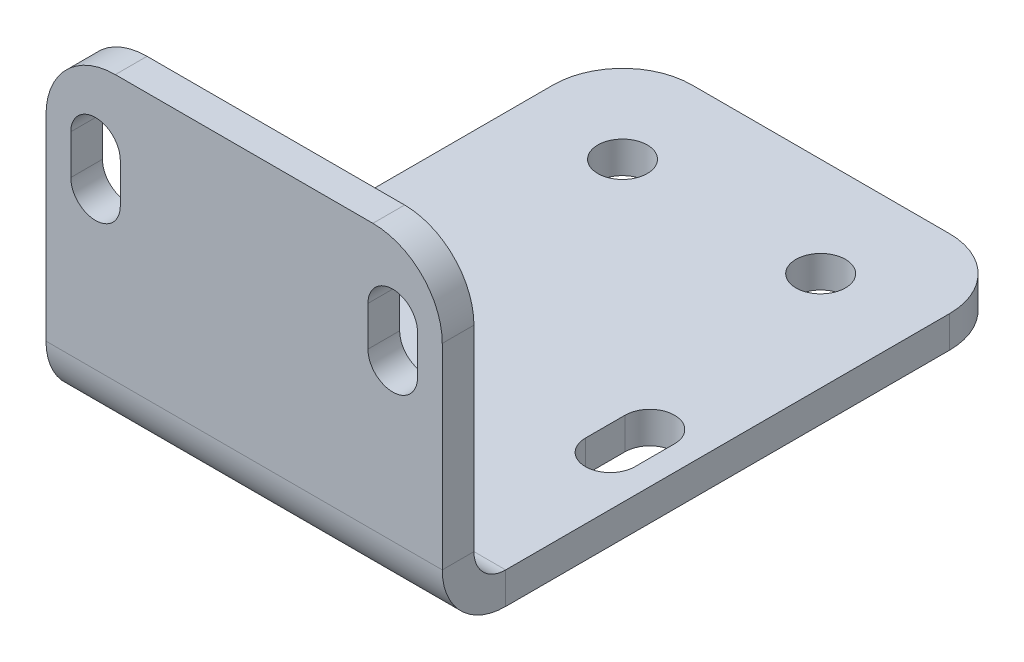
ISO-10303-21;
HEADER;
FILE_DESCRIPTION(('STEP AP214'),'2;1');
FILE_NAME('part.step','',(''),(''),'','','');
FILE_SCHEMA(('AUTOMOTIVE_DESIGN { 1 0 10303 214 1 1 1 1 }'));
ENDSEC;
DATA;
#1=APPLICATION_CONTEXT('core data for automotive mechanical design processes');
#2=APPLICATION_PROTOCOL_DEFINITION('international standard','automotive_design',2000,#1);
#3=PRODUCT_CONTEXT('',#1,'mechanical');
#4=PRODUCT('Part','Part','',(#3));
#5=PRODUCT_RELATED_PRODUCT_CATEGORY('part','',(#4));
#6=PRODUCT_DEFINITION_FORMATION('','',#4);
#7=PRODUCT_DEFINITION_CONTEXT('part definition',#1,'design');
#8=PRODUCT_DEFINITION('design','',#6,#7);
#9=PRODUCT_DEFINITION_SHAPE('','',#8);
#10=(LENGTH_UNIT() NAMED_UNIT(*) SI_UNIT(.MILLI.,.METRE.));
#11=(NAMED_UNIT(*) PLANE_ANGLE_UNIT() SI_UNIT($,.RADIAN.));
#12=(NAMED_UNIT(*) SI_UNIT($,.STERADIAN.) SOLID_ANGLE_UNIT());
#13=UNCERTAINTY_MEASURE_WITH_UNIT(LENGTH_MEASURE(1.E-05),#10,'distance_accuracy_value','');
#14=(GEOMETRIC_REPRESENTATION_CONTEXT(3) GLOBAL_UNCERTAINTY_ASSIGNED_CONTEXT((#13)) GLOBAL_UNIT_ASSIGNED_CONTEXT((#10,
#11,#12)) REPRESENTATION_CONTEXT('',''));
#15=CARTESIAN_POINT('',(0.,0.,0.));
#16=DIRECTION('',(0.,0.,1.));
#17=DIRECTION('',(1.,0.,0.));
#18=AXIS2_PLACEMENT_3D('',#15,#16,#17);
#19=CARTESIAN_POINT('',(66.59293258347,-30.0000000000001,-22.75));
#20=DIRECTION('',(0.,1.,0.));
#21=DIRECTION('',(0.,0.,1.));
#22=AXIS2_PLACEMENT_3D('',#19,#20,#21);
#23=CYLINDRICAL_SURFACE('',#22,2.5);
#24=DIRECTION('',(0.,1.,0.));
#25=VECTOR('',#24,1.);
#26=CARTESIAN_POINT('',(64.09293258347,-30.0000000000001,-22.75));
#27=LINE('',#26,#25);
#28=CARTESIAN_POINT('',(64.09293258347,-33.2000000000001,-22.75));
#29=VERTEX_POINT('',#28);
#30=CARTESIAN_POINT('',(64.09293258347,-30.0000000000001,-22.75));
#31=VERTEX_POINT('',#30);
#32=EDGE_CURVE('E11',#29,#31,#27,.T.);
#33=ORIENTED_EDGE('',*,*,#32,.F.);
#34=CARTESIAN_POINT('',(66.59293258347,-33.2000000000001,-22.75));
#35=DIRECTION('',(0.,1.,0.));
#36=DIRECTION('',(0.,0.,1.));
#37=AXIS2_PLACEMENT_3D('',#34,#35,#36);
#38=CIRCLE('',#37,2.5);
#39=CARTESIAN_POINT('',(69.09293258347,-33.2000000000001,-22.75));
#40=VERTEX_POINT('',#39);
#41=EDGE_CURVE('E167',#40,#29,#38,.T.);
#42=ORIENTED_EDGE('',*,*,#41,.F.);
#43=DIRECTION('',(0.,1.,0.));
#44=VECTOR('',#43,1.);
#45=CARTESIAN_POINT('',(69.09293258347,-30.0000000000001,-22.75));
#46=LINE('',#45,#44);
#47=CARTESIAN_POINT('',(69.09293258347,-30.0000000000001,-22.75));
#48=VERTEX_POINT('',#47);
#49=EDGE_CURVE('E47',#40,#48,#46,.T.);
#50=ORIENTED_EDGE('',*,*,#49,.T.);
#51=CARTESIAN_POINT('',(66.59293258347,-30.0000000000001,-22.75));
#52=DIRECTION('',(0.,1.,0.));
#53=DIRECTION('',(1.,0.,0.));
#54=AXIS2_PLACEMENT_3D('',#51,#52,#53);
#55=CIRCLE('',#54,2.5);
#56=EDGE_CURVE('E258',#48,#31,#55,.T.);
#57=ORIENTED_EDGE('',*,*,#56,.T.);
#58=EDGE_LOOP('',(#33,#42,#50,#57));
#59=FACE_BOUND('',#58,.T.);
#60=ADVANCED_FACE('F37',(#59),#23,.F.);
#61=CARTESIAN_POINT('',(69.09293258347,-30.0000000000001,-18.75));
#62=DIRECTION('',(-1.,0.,0.));
#63=DIRECTION('',(0.,0.,-1.));
#64=AXIS2_PLACEMENT_3D('',#61,#62,#63);
#65=PLANE('',#64);
#66=ORIENTED_EDGE('',*,*,#49,.F.);
#67=DIRECTION('',(0.,0.,1.));
#68=VECTOR('',#67,1.);
#69=CARTESIAN_POINT('',(69.09293258347,-33.2000000000001,-30.));
#70=LINE('',#69,#68);
#71=CARTESIAN_POINT('',(69.09293258347,-33.2000000000001,-18.75));
#72=VERTEX_POINT('',#71);
#73=EDGE_CURVE('E180',#72,#40,#70,.F.);
#74=ORIENTED_EDGE('',*,*,#73,.F.);
#75=DIRECTION('',(0.,1.,0.));
#76=VECTOR('',#75,1.);
#77=CARTESIAN_POINT('',(69.09293258347,-30.0000000000001,-18.75));
#78=LINE('',#77,#76);
#79=CARTESIAN_POINT('',(69.09293258347,-30.0000000000001,-18.75));
#80=VERTEX_POINT('',#79);
#81=EDGE_CURVE('E159',#72,#80,#78,.T.);
#82=ORIENTED_EDGE('',*,*,#81,.T.);
#83=DIRECTION('',(0.,0.,-1.));
#84=VECTOR('',#83,1.);
#85=CARTESIAN_POINT('',(69.09293258347,-30.0000000000001,-18.75));
#86=LINE('',#85,#84);
#87=EDGE_CURVE('E266',#80,#48,#86,.T.);
#88=ORIENTED_EDGE('',*,*,#87,.T.);
#89=EDGE_LOOP('',(#66,#74,#82,#88));
#90=FACE_BOUND('',#89,.T.);
#91=ADVANCED_FACE('F268',(#90),#65,.T.);
#92=CARTESIAN_POINT('',(66.59293258347,-30.0000000000001,-18.75));
#93=DIRECTION('',(0.,1.,0.));
#94=DIRECTION('',(0.,0.,1.));
#95=AXIS2_PLACEMENT_3D('',#92,#93,#94);
#96=CYLINDRICAL_SURFACE('',#95,2.5);
#97=ORIENTED_EDGE('',*,*,#81,.F.);
#98=CARTESIAN_POINT('',(66.59293258347,-33.2000000000001,-18.75));
#99=DIRECTION('',(0.,1.,0.));
#100=DIRECTION('',(0.,0.,1.));
#101=AXIS2_PLACEMENT_3D('',#98,#99,#100);
#102=CIRCLE('',#101,2.5);
#103=CARTESIAN_POINT('',(64.09293258347,-33.2000000000001,-18.75));
#104=VERTEX_POINT('',#103);
#105=EDGE_CURVE('E165',#104,#72,#102,.T.);
#106=ORIENTED_EDGE('',*,*,#105,.F.);
#107=DIRECTION('',(0.,1.,0.));
#108=VECTOR('',#107,1.);
#109=CARTESIAN_POINT('',(64.09293258347,-30.0000000000001,-18.75));
#110=LINE('',#109,#108);
#111=CARTESIAN_POINT('',(64.09293258347,-30.0000000000001,-18.75));
#112=VERTEX_POINT('',#111);
#113=EDGE_CURVE('E41',#104,#112,#110,.T.);
#114=ORIENTED_EDGE('',*,*,#113,.T.);
#115=CARTESIAN_POINT('',(66.59293258347,-30.0000000000001,-18.75));
#116=DIRECTION('',(0.,1.,0.));
#117=DIRECTION('',(1.,0.,0.));
#118=AXIS2_PLACEMENT_3D('',#115,#116,#117);
#119=CIRCLE('',#118,2.5);
#120=EDGE_CURVE('E522',#112,#80,#119,.T.);
#121=ORIENTED_EDGE('',*,*,#120,.T.);
#122=EDGE_LOOP('',(#97,#106,#114,#121));
#123=FACE_BOUND('',#122,.T.);
#124=ADVANCED_FACE('F169',(#123),#96,.F.);
#125=CARTESIAN_POINT('',(36.5929325836299,-30.0000000000001,-22.75));
#126=DIRECTION('',(0.,1.,0.));
#127=DIRECTION('',(0.,0.,1.));
#128=AXIS2_PLACEMENT_3D('',#125,#126,#127);
#129=CYLINDRICAL_SURFACE('',#128,2.5);
#130=DIRECTION('',(0.,1.,0.));
#131=VECTOR('',#130,1.);
#132=CARTESIAN_POINT('',(34.0929325836299,-30.0000000000001,-22.75));
#133=LINE('',#132,#131);
#134=CARTESIAN_POINT('',(34.0929325836299,-33.2000000000001,-22.75));
#135=VERTEX_POINT('',#134);
#136=CARTESIAN_POINT('',(34.0929325836299,-30.0000000000001,-22.75));
#137=VERTEX_POINT('',#136);
#138=EDGE_CURVE('E160',#135,#137,#133,.T.);
#139=ORIENTED_EDGE('',*,*,#138,.F.);
#140=CARTESIAN_POINT('',(36.5929325836299,-33.2000000000001,-22.75));
#141=DIRECTION('',(0.,1.,0.));
#142=DIRECTION('',(0.,0.,1.));
#143=AXIS2_PLACEMENT_3D('',#140,#141,#142);
#144=CIRCLE('',#143,2.5);
#145=CARTESIAN_POINT('',(39.0929325836299,-33.2000000000001,-22.75));
#146=VERTEX_POINT('',#145);
#147=EDGE_CURVE('E400',#146,#135,#144,.T.);
#148=ORIENTED_EDGE('',*,*,#147,.F.);
#149=DIRECTION('',(0.,1.,0.));
#150=VECTOR('',#149,1.);
#151=CARTESIAN_POINT('',(39.0929325836299,-30.0000000000001,-22.75));
#152=LINE('',#151,#150);
#153=CARTESIAN_POINT('',(39.0929325836299,-30.0000000000001,-22.75));
#154=VERTEX_POINT('',#153);
#155=EDGE_CURVE('E246',#146,#154,#152,.T.);
#156=ORIENTED_EDGE('',*,*,#155,.T.);
#157=CARTESIAN_POINT('',(36.5929325836299,-30.0000000000001,-22.75));
#158=DIRECTION('',(0.,1.,0.));
#159=DIRECTION('',(1.,0.,0.));
#160=AXIS2_PLACEMENT_3D('',#157,#158,#159);
#161=CIRCLE('',#160,2.5);
#162=EDGE_CURVE('E533',#154,#137,#161,.T.);
#163=ORIENTED_EDGE('',*,*,#162,.T.);
#164=EDGE_LOOP('',(#139,#148,#156,#163));
#165=FACE_BOUND('',#164,.T.);
#166=ADVANCED_FACE('F578',(#165),#129,.F.);
#167=CARTESIAN_POINT('',(39.0929325836299,-30.0000000000001,-18.75));
#168=DIRECTION('',(-1.,0.,0.));
#169=DIRECTION('',(0.,0.,-1.));
#170=AXIS2_PLACEMENT_3D('',#167,#168,#169);
#171=PLANE('',#170);
#172=ORIENTED_EDGE('',*,*,#155,.F.);
#173=DIRECTION('',(0.,0.,1.));
#174=VECTOR('',#173,1.);
#175=CARTESIAN_POINT('',(39.0929325836299,-33.2000000000001,-30.));
#176=LINE('',#175,#174);
#177=CARTESIAN_POINT('',(39.0929325836299,-33.2000000000001,-18.75));
#178=VERTEX_POINT('',#177);
#179=EDGE_CURVE('E385',#178,#146,#176,.F.);
#180=ORIENTED_EDGE('',*,*,#179,.F.);
#181=DIRECTION('',(0.,1.,0.));
#182=VECTOR('',#181,1.);
#183=CARTESIAN_POINT('',(39.0929325836299,-30.0000000000001,-18.75));
#184=LINE('',#183,#182);
#185=CARTESIAN_POINT('',(39.0929325836299,-30.0000000000001,-18.75));
#186=VERTEX_POINT('',#185);
#187=EDGE_CURVE('E243',#178,#186,#184,.T.);
#188=ORIENTED_EDGE('',*,*,#187,.T.);
#189=DIRECTION('',(0.,0.,-1.));
#190=VECTOR('',#189,1.);
#191=CARTESIAN_POINT('',(39.0929325836299,-30.0000000000001,-18.75));
#192=LINE('',#191,#190);
#193=EDGE_CURVE('E421',#186,#154,#192,.T.);
#194=ORIENTED_EDGE('',*,*,#193,.T.);
#195=EDGE_LOOP('',(#172,#180,#188,#194));
#196=FACE_BOUND('',#195,.T.);
#197=ADVANCED_FACE('F419',(#196),#171,.T.);
#198=CARTESIAN_POINT('',(36.5929325836299,-30.0000000000001,-18.75));
#199=DIRECTION('',(0.,1.,0.));
#200=DIRECTION('',(0.,0.,1.));
#201=AXIS2_PLACEMENT_3D('',#198,#199,#200);
#202=CYLINDRICAL_SURFACE('',#201,2.5);
#203=ORIENTED_EDGE('',*,*,#187,.F.);
#204=CARTESIAN_POINT('',(36.5929325836299,-33.2000000000001,-18.75));
#205=DIRECTION('',(0.,1.,0.));
#206=DIRECTION('',(0.,0.,1.));
#207=AXIS2_PLACEMENT_3D('',#204,#205,#206);
#208=CIRCLE('',#207,2.5);
#209=CARTESIAN_POINT('',(34.0929325836299,-33.2000000000001,-18.75));
#210=VERTEX_POINT('',#209);
#211=EDGE_CURVE('E396',#210,#178,#208,.T.);
#212=ORIENTED_EDGE('',*,*,#211,.F.);
#213=DIRECTION('',(0.,1.,0.));
#214=VECTOR('',#213,1.);
#215=CARTESIAN_POINT('',(34.0929325836299,-30.0000000000001,-18.75));
#216=LINE('',#215,#214);
#217=CARTESIAN_POINT('',(34.0929325836299,-30.0000000000001,-18.75));
#218=VERTEX_POINT('',#217);
#219=EDGE_CURVE('E241',#210,#218,#216,.T.);
#220=ORIENTED_EDGE('',*,*,#219,.T.);
#221=CARTESIAN_POINT('',(36.5929325836299,-30.0000000000001,-18.75));
#222=DIRECTION('',(0.,1.,0.));
#223=DIRECTION('',(1.,0.,0.));
#224=AXIS2_PLACEMENT_3D('',#221,#222,#223);
#225=CIRCLE('',#224,2.5);
#226=EDGE_CURVE('E415',#218,#186,#225,.T.);
#227=ORIENTED_EDGE('',*,*,#226,.T.);
#228=EDGE_LOOP('',(#203,#212,#220,#227));
#229=FACE_BOUND('',#228,.T.);
#230=ADVANCED_FACE('F411',(#229),#202,.F.);
#231=CARTESIAN_POINT('',(71.5929325834699,-30.0000000000001,-30.));
#232=DIRECTION('',(-1.,0.,0.));
#233=DIRECTION('',(0.,0.,-1.));
#234=AXIS2_PLACEMENT_3D('',#231,#232,#233);
#235=PLANE('',#234);
#236=DIRECTION('',(0.,1.,0.));
#237=VECTOR('',#236,1.);
#238=CARTESIAN_POINT('',(71.59293258347,-30.,-3.19999999999999));
#239=LINE('',#238,#237);
#240=CARTESIAN_POINT('',(71.59293258347,-33.2,-3.19999999999998));
#241=VERTEX_POINT('',#240);
#242=CARTESIAN_POINT('',(71.59293258347,-30.,-3.19999999999999));
#243=VERTEX_POINT('',#242);
#244=EDGE_CURVE('E238',#241,#243,#239,.T.);
#245=ORIENTED_EDGE('',*,*,#244,.F.);
#246=DIRECTION('',(0.,0.,1.));
#247=VECTOR('',#246,1.);
#248=CARTESIAN_POINT('',(71.59293258347,-33.2000000000001,-30.));
#249=LINE('',#248,#247);
#250=CARTESIAN_POINT('',(71.5929325834699,-33.2000000000002,-48.));
#251=VERTEX_POINT('',#250);
#252=EDGE_CURVE('E174',#241,#251,#249,.F.);
#253=ORIENTED_EDGE('',*,*,#252,.T.);
#254=DIRECTION('',(0.,1.,0.));
#255=VECTOR('',#254,1.);
#256=CARTESIAN_POINT('',(71.5929325834699,-30.0000000000002,-48.));
#257=LINE('',#256,#255);
#258=CARTESIAN_POINT('',(71.5929325834699,-30.0000000000002,-48.));
#259=VERTEX_POINT('',#258);
#260=EDGE_CURVE('E235',#251,#259,#257,.T.);
#261=ORIENTED_EDGE('',*,*,#260,.T.);
#262=DIRECTION('',(0.,0.,-1.));
#263=VECTOR('',#262,1.);
#264=CARTESIAN_POINT('',(71.5929325834699,-30.0000000000001,-30.));
#265=LINE('',#264,#263);
#266=EDGE_CURVE('E313',#243,#259,#265,.T.);
#267=ORIENTED_EDGE('',*,*,#266,.F.);
#268=EDGE_LOOP('',(#245,#253,#261,#267));
#269=FACE_BOUND('',#268,.T.);
#270=ADVANCED_FACE('F475',(#269),#235,.F.);
#271=CARTESIAN_POINT('',(64.59293258347,-30.0000000000002,-48.));
#272=DIRECTION('',(0.,-1.,0.));
#273=DIRECTION('',(0.,0.,-1.));
#274=AXIS2_PLACEMENT_3D('',#271,#272,#273);
#275=CYLINDRICAL_SURFACE('',#274,7.);
#276=ORIENTED_EDGE('',*,*,#260,.F.);
#277=CARTESIAN_POINT('',(64.59293258347,-33.2000000000002,-48.));
#278=DIRECTION('',(0.,-1.,0.));
#279=DIRECTION('',(0.,0.,-1.));
#280=AXIS2_PLACEMENT_3D('',#277,#278,#279);
#281=CIRCLE('',#280,7.);
#282=CARTESIAN_POINT('',(64.59293258347,-33.2000000000002,-55.));
#283=VERTEX_POINT('',#282);
#284=EDGE_CURVE('E171',#251,#283,#281,.F.);
#285=ORIENTED_EDGE('',*,*,#284,.T.);
#286=DIRECTION('',(0.,1.,0.));
#287=VECTOR('',#286,1.);
#288=CARTESIAN_POINT('',(64.59293258347,-30.0000000000001,-55.));
#289=LINE('',#288,#287);
#290=CARTESIAN_POINT('',(64.59293258347,-30.0000000000001,-55.));
#291=VERTEX_POINT('',#290);
#292=EDGE_CURVE('E232',#283,#291,#289,.T.);
#293=ORIENTED_EDGE('',*,*,#292,.T.);
#294=CARTESIAN_POINT('',(64.59293258347,-30.0000000000002,-48.));
#295=DIRECTION('',(0.,-1.,0.));
#296=DIRECTION('',(0.,0.,-1.));
#297=AXIS2_PLACEMENT_3D('',#294,#295,#296);
#298=CIRCLE('',#297,7.);
#299=EDGE_CURVE('E479',#259,#291,#298,.F.);
#300=ORIENTED_EDGE('',*,*,#299,.F.);
#301=EDGE_LOOP('',(#276,#285,#293,#300));
#302=FACE_BOUND('',#301,.T.);
#303=ADVANCED_FACE('F520',(#302),#275,.T.);
#304=CARTESIAN_POINT('',(31.5929325836299,-30.0000000000001,-55.));
#305=DIRECTION('',(0.,0.,-1.));
#306=DIRECTION('',(1.,0.,0.));
#307=AXIS2_PLACEMENT_3D('',#304,#305,#306);
#308=PLANE('',#307);
#309=ORIENTED_EDGE('',*,*,#292,.F.);
#310=DIRECTION('',(1.,0.,0.));
#311=VECTOR('',#310,1.);
#312=CARTESIAN_POINT('',(0.,-33.2000000000002,-55.));
#313=LINE('',#312,#311);
#314=CARTESIAN_POINT('',(38.5929325836299,-33.2000000000002,-55.));
#315=VERTEX_POINT('',#314);
#316=EDGE_CURVE('E383',#315,#283,#313,.T.);
#317=ORIENTED_EDGE('',*,*,#316,.F.);
#318=DIRECTION('',(0.,1.,0.));
#319=VECTOR('',#318,1.);
#320=CARTESIAN_POINT('',(38.5929325836299,-30.0000000000001,-55.));
#321=LINE('',#320,#319);
#322=CARTESIAN_POINT('',(38.5929325836299,-30.0000000000001,-55.));
#323=VERTEX_POINT('',#322);
#324=EDGE_CURVE('E229',#315,#323,#321,.T.);
#325=ORIENTED_EDGE('',*,*,#324,.T.);
#326=DIRECTION('',(1.,0.,0.));
#327=VECTOR('',#326,1.);
#328=CARTESIAN_POINT('',(31.5929325836299,-30.0000000000001,-55.));
#329=LINE('',#328,#327);
#330=EDGE_CURVE('E530',#323,#291,#329,.T.);
#331=ORIENTED_EDGE('',*,*,#330,.T.);
#332=EDGE_LOOP('',(#309,#317,#325,#331));
#333=FACE_BOUND('',#332,.T.);
#334=ADVANCED_FACE('F592',(#333),#308,.T.);
#335=CARTESIAN_POINT('',(38.5929325836299,-30.0000000000002,-48.));
#336=DIRECTION('',(0.,-1.,0.));
#337=DIRECTION('',(0.,0.,-1.));
#338=AXIS2_PLACEMENT_3D('',#335,#336,#337);
#339=CYLINDRICAL_SURFACE('',#338,7.);
#340=ORIENTED_EDGE('',*,*,#324,.F.);
#341=CARTESIAN_POINT('',(38.5929325836299,-33.2000000000002,-48.));
#342=DIRECTION('',(0.,-1.,0.));
#343=DIRECTION('',(0.,0.,-1.));
#344=AXIS2_PLACEMENT_3D('',#341,#342,#343);
#345=CIRCLE('',#344,7.);
#346=CARTESIAN_POINT('',(31.5929325836299,-33.2000000000002,-48.));
#347=VERTEX_POINT('',#346);
#348=EDGE_CURVE('E380',#315,#347,#345,.F.);
#349=ORIENTED_EDGE('',*,*,#348,.T.);
#350=DIRECTION('',(0.,1.,0.));
#351=VECTOR('',#350,1.);
#352=CARTESIAN_POINT('',(31.5929325836299,-30.0000000000002,-48.));
#353=LINE('',#352,#351);
#354=CARTESIAN_POINT('',(31.5929325836299,-30.0000000000002,-48.));
#355=VERTEX_POINT('',#354);
#356=EDGE_CURVE('E226',#347,#355,#353,.T.);
#357=ORIENTED_EDGE('',*,*,#356,.T.);
#358=CARTESIAN_POINT('',(38.5929325836299,-30.0000000000002,-48.));
#359=DIRECTION('',(0.,-1.,0.));
#360=DIRECTION('',(0.,0.,-1.));
#361=AXIS2_PLACEMENT_3D('',#358,#359,#360);
#362=CIRCLE('',#361,7.);
#363=EDGE_CURVE('E487',#323,#355,#362,.F.);
#364=ORIENTED_EDGE('',*,*,#363,.F.);
#365=EDGE_LOOP('',(#340,#349,#357,#364));
#366=FACE_BOUND('',#365,.T.);
#367=ADVANCED_FACE('F635',(#366),#339,.T.);
#368=CARTESIAN_POINT('',(31.5929325836299,-30.0000000000001,-30.));
#369=DIRECTION('',(1.,0.,0.));
#370=DIRECTION('',(0.,0.,1.));
#371=AXIS2_PLACEMENT_3D('',#368,#369,#370);
#372=PLANE('',#371);
#373=ORIENTED_EDGE('',*,*,#356,.F.);
#374=DIRECTION('',(0.,0.,1.));
#375=VECTOR('',#374,1.);
#376=CARTESIAN_POINT('',(31.5929325836299,-33.2000000000001,-30.));
#377=LINE('',#376,#375);
#378=CARTESIAN_POINT('',(31.5929325836299,-33.2,-3.19999999999998));
#379=VERTEX_POINT('',#378);
#380=EDGE_CURVE('E377',#347,#379,#377,.T.);
#381=ORIENTED_EDGE('',*,*,#380,.T.);
#382=DIRECTION('',(0.,1.,0.));
#383=VECTOR('',#382,1.);
#384=CARTESIAN_POINT('',(31.5929325836299,-30.,-3.19999999999999));
#385=LINE('',#384,#383);
#386=CARTESIAN_POINT('',(31.5929325836299,-30.,-3.19999999999999));
#387=VERTEX_POINT('',#386);
#388=EDGE_CURVE('E223',#379,#387,#385,.T.);
#389=ORIENTED_EDGE('',*,*,#388,.T.);
#390=DIRECTION('',(0.,0.,1.));
#391=VECTOR('',#390,1.);
#392=CARTESIAN_POINT('',(31.5929325836299,-30.0000000000001,-30.));
#393=LINE('',#392,#391);
#394=EDGE_CURVE('E480',#355,#387,#393,.T.);
#395=ORIENTED_EDGE('',*,*,#394,.F.);
#396=EDGE_LOOP('',(#373,#381,#389,#395));
#397=FACE_BOUND('',#396,.T.);
#398=ADVANCED_FACE('F632',(#397),#372,.F.);
#399=CARTESIAN_POINT('',(31.5929325836299,-26.8,-3.2));
#400=DIRECTION('',(1.,0.,0.));
#401=DIRECTION('',(0.,0.,-1.));
#402=AXIS2_PLACEMENT_3D('',#399,#400,#401);
#403=PLANE('',#402);
#404=ORIENTED_EDGE('',*,*,#388,.F.);
#405=CARTESIAN_POINT('',(31.5929325836299,-26.8,-3.2));
#406=DIRECTION('',(-1.,0.,0.));
#407=DIRECTION('',(0.,0.,1.));
#408=AXIS2_PLACEMENT_3D('',#405,#406,#407);
#409=CIRCLE('',#408,6.4);
#410=CARTESIAN_POINT('',(31.5929325836299,-26.8,3.2));
#411=VERTEX_POINT('',#410);
#412=EDGE_CURVE('E372',#379,#411,#409,.T.);
#413=ORIENTED_EDGE('',*,*,#412,.T.);
#414=DIRECTION('',(0.,0.,-1.));
#415=VECTOR('',#414,1.);
#416=CARTESIAN_POINT('',(31.5929325836299,-26.8,0.));
#417=LINE('',#416,#415);
#418=CARTESIAN_POINT('',(31.5929325836299,-26.8,0.));
#419=VERTEX_POINT('',#418);
#420=EDGE_CURVE('E221',#411,#419,#417,.T.);
#421=ORIENTED_EDGE('',*,*,#420,.T.);
#422=CARTESIAN_POINT('',(31.5929325836299,-26.8,-3.2));
#423=DIRECTION('',(-1.,0.,0.));
#424=DIRECTION('',(0.,0.,1.));
#425=AXIS2_PLACEMENT_3D('',#422,#423,#424);
#426=CIRCLE('',#425,3.2);
#427=EDGE_CURVE('E324',#387,#419,#426,.T.);
#428=ORIENTED_EDGE('',*,*,#427,.F.);
#429=EDGE_LOOP('',(#404,#413,#421,#428));
#430=FACE_BOUND('',#429,.T.);
#431=ADVANCED_FACE('F491',(#430),#403,.F.);
#432=CARTESIAN_POINT('',(31.5929325836299,0.,0.));
#433=DIRECTION('',(-1.,0.,0.));
#434=DIRECTION('',(0.,-1.,0.));
#435=AXIS2_PLACEMENT_3D('',#432,#433,#434);
#436=PLANE('',#435);
#437=ORIENTED_EDGE('',*,*,#420,.F.);
#438=DIRECTION('',(0.,1.,0.));
#439=VECTOR('',#438,1.);
#440=CARTESIAN_POINT('',(31.5929325836299,0.,3.2));
#441=LINE('',#440,#439);
#442=CARTESIAN_POINT('',(31.5929325836299,-7.,3.2));
#443=VERTEX_POINT('',#442);
#444=EDGE_CURVE('E353',#443,#411,#441,.F.);
#445=ORIENTED_EDGE('',*,*,#444,.F.);
#446=DIRECTION('',(0.,0.,-1.));
#447=VECTOR('',#446,1.);
#448=CARTESIAN_POINT('',(31.5929325836299,-7.,0.));
#449=LINE('',#448,#447);
#450=CARTESIAN_POINT('',(31.5929325836299,-7.,0.));
#451=VERTEX_POINT('',#450);
#452=EDGE_CURVE('E218',#443,#451,#449,.T.);
#453=ORIENTED_EDGE('',*,*,#452,.T.);
#454=DIRECTION('',(0.,-1.,0.));
#455=VECTOR('',#454,1.);
#456=CARTESIAN_POINT('',(31.5929325836299,0.,0.));
#457=LINE('',#456,#455);
#458=EDGE_CURVE('E296',#451,#419,#457,.T.);
#459=ORIENTED_EDGE('',*,*,#458,.T.);
#460=EDGE_LOOP('',(#437,#445,#453,#459));
#461=FACE_BOUND('',#460,.T.);
#462=ADVANCED_FACE('F495',(#461),#436,.T.);
#463=CARTESIAN_POINT('',(38.5929325836299,-7.,0.));
#464=DIRECTION('',(0.,0.,1.));
#465=DIRECTION('',(1.,0.,0.));
#466=AXIS2_PLACEMENT_3D('',#463,#464,#465);
#467=CYLINDRICAL_SURFACE('',#466,7.);
#468=ORIENTED_EDGE('',*,*,#452,.F.);
#469=CARTESIAN_POINT('',(38.5929325836299,-7.,3.2));
#470=DIRECTION('',(0.,0.,1.));
#471=DIRECTION('',(1.,0.,0.));
#472=AXIS2_PLACEMENT_3D('',#469,#470,#471);
#473=CIRCLE('',#472,7.);
#474=CARTESIAN_POINT('',(38.5929325836299,0.,3.2));
#475=VERTEX_POINT('',#474);
#476=EDGE_CURVE('E367',#443,#475,#473,.F.);
#477=ORIENTED_EDGE('',*,*,#476,.T.);
#478=DIRECTION('',(0.,0.,-1.));
#479=VECTOR('',#478,1.);
#480=CARTESIAN_POINT('',(38.5929325836299,0.,0.));
#481=LINE('',#480,#479);
#482=CARTESIAN_POINT('',(38.5929325836299,0.,0.));
#483=VERTEX_POINT('',#482);
#484=EDGE_CURVE('E215',#475,#483,#481,.T.);
#485=ORIENTED_EDGE('',*,*,#484,.T.);
#486=CARTESIAN_POINT('',(38.5929325836299,-7.,0.));
#487=DIRECTION('',(0.,0.,1.));
#488=DIRECTION('',(1.,0.,0.));
#489=AXIS2_PLACEMENT_3D('',#486,#487,#488);
#490=CIRCLE('',#489,7.);
#491=EDGE_CURVE('E299',#451,#483,#490,.F.);
#492=ORIENTED_EDGE('',*,*,#491,.F.);
#493=EDGE_LOOP('',(#468,#477,#485,#492));
#494=FACE_BOUND('',#493,.T.);
#495=ADVANCED_FACE('F623',(#494),#467,.T.);
#496=CARTESIAN_POINT('',(31.5929325836299,0.,0.));
#497=DIRECTION('',(0.,1.,0.));
#498=DIRECTION('',(-1.,0.,0.));
#499=AXIS2_PLACEMENT_3D('',#496,#497,#498);
#500=PLANE('',#499);
#501=ORIENTED_EDGE('',*,*,#484,.F.);
#502=DIRECTION('',(1.,0.,0.));
#503=VECTOR('',#502,1.);
#504=CARTESIAN_POINT('',(0.,0.,3.2));
#505=LINE('',#504,#503);
#506=CARTESIAN_POINT('',(64.59293258347,0.,3.2));
#507=VERTEX_POINT('',#506);
#508=EDGE_CURVE('E364',#507,#475,#505,.F.);
#509=ORIENTED_EDGE('',*,*,#508,.F.);
#510=DIRECTION('',(0.,0.,-1.));
#511=VECTOR('',#510,1.);
#512=CARTESIAN_POINT('',(64.59293258347,0.,0.));
#513=LINE('',#512,#511);
#514=CARTESIAN_POINT('',(64.59293258347,0.,0.));
#515=VERTEX_POINT('',#514);
#516=EDGE_CURVE('E212',#507,#515,#513,.T.);
#517=ORIENTED_EDGE('',*,*,#516,.T.);
#518=DIRECTION('',(-1.,0.,0.));
#519=VECTOR('',#518,1.);
#520=CARTESIAN_POINT('',(31.5929325836299,0.,0.));
#521=LINE('',#520,#519);
#522=EDGE_CURVE('E304',#515,#483,#521,.T.);
#523=ORIENTED_EDGE('',*,*,#522,.T.);
#524=EDGE_LOOP('',(#501,#509,#517,#523));
#525=FACE_BOUND('',#524,.T.);
#526=ADVANCED_FACE('F620',(#525),#500,.T.);
#527=CARTESIAN_POINT('',(64.59293258347,-7.,0.));
#528=DIRECTION('',(0.,0.,1.));
#529=DIRECTION('',(1.,0.,0.));
#530=AXIS2_PLACEMENT_3D('',#527,#528,#529);
#531=CYLINDRICAL_SURFACE('',#530,7.);
#532=ORIENTED_EDGE('',*,*,#516,.F.);
#533=CARTESIAN_POINT('',(64.59293258347,-7.,3.2));
#534=DIRECTION('',(0.,0.,1.));
#535=DIRECTION('',(1.,0.,0.));
#536=AXIS2_PLACEMENT_3D('',#533,#534,#535);
#537=CIRCLE('',#536,7.);
#538=CARTESIAN_POINT('',(71.5929325834699,-7.,3.2));
#539=VERTEX_POINT('',#538);
#540=EDGE_CURVE('E361',#507,#539,#537,.F.);
#541=ORIENTED_EDGE('',*,*,#540,.T.);
#542=DIRECTION('',(0.,0.,-1.));
#543=VECTOR('',#542,1.);
#544=CARTESIAN_POINT('',(71.5929325834699,-7.,0.));
#545=LINE('',#544,#543);
#546=CARTESIAN_POINT('',(71.5929325834699,-7.,0.));
#547=VERTEX_POINT('',#546);
#548=EDGE_CURVE('E209',#539,#547,#545,.T.);
#549=ORIENTED_EDGE('',*,*,#548,.T.);
#550=CARTESIAN_POINT('',(64.59293258347,-7.,0.));
#551=DIRECTION('',(0.,0.,1.));
#552=DIRECTION('',(1.,0.,0.));
#553=AXIS2_PLACEMENT_3D('',#550,#551,#552);
#554=CIRCLE('',#553,7.);
#555=EDGE_CURVE('E307',#515,#547,#554,.F.);
#556=ORIENTED_EDGE('',*,*,#555,.F.);
#557=EDGE_LOOP('',(#532,#541,#549,#556));
#558=FACE_BOUND('',#557,.T.);
#559=ADVANCED_FACE('F505',(#558),#531,.T.);
#560=CARTESIAN_POINT('',(71.5929325834699,0.,0.));
#561=DIRECTION('',(1.,0.,0.));
#562=DIRECTION('',(0.,1.,0.));
#563=AXIS2_PLACEMENT_3D('',#560,#561,#562);
#564=PLANE('',#563);
#565=ORIENTED_EDGE('',*,*,#548,.F.);
#566=DIRECTION('',(0.,1.,0.));
#567=VECTOR('',#566,1.);
#568=CARTESIAN_POINT('',(71.59293258347,0.,3.2));
#569=LINE('',#568,#567);
#570=CARTESIAN_POINT('',(71.59293258347,-26.8,3.2));
#571=VERTEX_POINT('',#570);
#572=EDGE_CURVE('E334',#571,#539,#569,.T.);
#573=ORIENTED_EDGE('',*,*,#572,.F.);
#574=DIRECTION('',(0.,0.,-1.));
#575=VECTOR('',#574,1.);
#576=CARTESIAN_POINT('',(71.59293258347,-26.8,0.));
#577=LINE('',#576,#575);
#578=CARTESIAN_POINT('',(71.59293258347,-26.8,0.));
#579=VERTEX_POINT('',#578);
#580=EDGE_CURVE('E55',#571,#579,#577,.T.);
#581=ORIENTED_EDGE('',*,*,#580,.T.);
#582=DIRECTION('',(0.,1.,0.));
#583=VECTOR('',#582,1.);
#584=CARTESIAN_POINT('',(71.5929325834699,0.,0.));
#585=LINE('',#584,#583);
#586=EDGE_CURVE('E310',#579,#547,#585,.T.);
#587=ORIENTED_EDGE('',*,*,#586,.T.);
#588=EDGE_LOOP('',(#565,#573,#581,#587));
#589=FACE_BOUND('',#588,.T.);
#590=ADVANCED_FACE('F502',(#589),#564,.T.);
#591=CARTESIAN_POINT('',(36.5929325836299,-7.24999999999999,0.));
#592=DIRECTION('',(0.,0.,1.));
#593=DIRECTION('',(1.,0.,0.));
#594=AXIS2_PLACEMENT_3D('',#591,#592,#593);
#595=CYLINDRICAL_SURFACE('',#594,2.5);
#596=DIRECTION('',(0.,0.,-1.));
#597=VECTOR('',#596,1.);
#598=CARTESIAN_POINT('',(39.0929325836299,-7.24999999999998,0.));
#599=LINE('',#598,#597);
#600=CARTESIAN_POINT('',(39.0929325836299,-7.24999999999998,3.2));
#601=VERTEX_POINT('',#600);
#602=CARTESIAN_POINT('',(39.0929325836299,-7.24999999999998,0.));
#603=VERTEX_POINT('',#602);
#604=EDGE_CURVE('E204',#601,#603,#599,.T.);
#605=ORIENTED_EDGE('',*,*,#604,.F.);
#606=CARTESIAN_POINT('',(36.5929325836299,-7.24999999999999,3.2));
#607=DIRECTION('',(0.,0.,1.));
#608=DIRECTION('',(1.,0.,0.));
#609=AXIS2_PLACEMENT_3D('',#606,#607,#608);
#610=CIRCLE('',#609,2.5);
#611=CARTESIAN_POINT('',(34.0929325836299,-7.24999999999999,3.2));
#612=VERTEX_POINT('',#611);
#613=EDGE_CURVE('E354',#601,#612,#610,.T.);
#614=ORIENTED_EDGE('',*,*,#613,.T.);
#615=DIRECTION('',(0.,0.,-1.));
#616=VECTOR('',#615,1.);
#617=CARTESIAN_POINT('',(34.0929325836299,-7.24999999999999,0.));
#618=LINE('',#617,#616);
#619=CARTESIAN_POINT('',(34.0929325836299,-7.24999999999999,0.));
#620=VERTEX_POINT('',#619);
#621=EDGE_CURVE('E201',#612,#620,#618,.T.);
#622=ORIENTED_EDGE('',*,*,#621,.T.);
#623=CARTESIAN_POINT('',(36.5929325836299,-7.24999999999999,0.));
#624=DIRECTION('',(0.,0.,1.));
#625=DIRECTION('',(1.,0.,0.));
#626=AXIS2_PLACEMENT_3D('',#623,#624,#625);
#627=CIRCLE('',#626,2.5);
#628=EDGE_CURVE('E290',#603,#620,#627,.T.);
#629=ORIENTED_EDGE('',*,*,#628,.F.);
#630=EDGE_LOOP('',(#605,#614,#622,#629));
#631=FACE_BOUND('',#630,.T.);
#632=ADVANCED_FACE('F614',(#631),#595,.F.);
#633=CARTESIAN_POINT('',(34.0929325836299,-11.25,0.));
#634=DIRECTION('',(-1.,0.,0.));
#635=DIRECTION('',(0.,-1.,0.));
#636=AXIS2_PLACEMENT_3D('',#633,#634,#635);
#637=PLANE('',#636);
#638=ORIENTED_EDGE('',*,*,#621,.F.);
#639=DIRECTION('',(0.,1.,0.));
#640=VECTOR('',#639,1.);
#641=CARTESIAN_POINT('',(34.0929325836299,0.,3.2));
#642=LINE('',#641,#640);
#643=CARTESIAN_POINT('',(34.0929325836299,-11.25,3.2));
#644=VERTEX_POINT('',#643);
#645=EDGE_CURVE('E350',#612,#644,#642,.F.);
#646=ORIENTED_EDGE('',*,*,#645,.T.);
#647=DIRECTION('',(0.,0.,-1.));
#648=VECTOR('',#647,1.);
#649=CARTESIAN_POINT('',(34.0929325836299,-11.25,0.));
#650=LINE('',#649,#648);
#651=CARTESIAN_POINT('',(34.0929325836299,-11.25,0.));
#652=VERTEX_POINT('',#651);
#653=EDGE_CURVE('E198',#644,#652,#650,.T.);
#654=ORIENTED_EDGE('',*,*,#653,.T.);
#655=DIRECTION('',(0.,-1.,0.));
#656=VECTOR('',#655,1.);
#657=CARTESIAN_POINT('',(34.0929325836299,-11.25,0.));
#658=LINE('',#657,#656);
#659=EDGE_CURVE('E293',#620,#652,#658,.T.);
#660=ORIENTED_EDGE('',*,*,#659,.F.);
#661=EDGE_LOOP('',(#638,#646,#654,#660));
#662=FACE_BOUND('',#661,.T.);
#663=ADVANCED_FACE('F682',(#662),#637,.F.);
#664=CARTESIAN_POINT('',(36.5929325836299,-11.25,0.));
#665=DIRECTION('',(0.,0.,1.));
#666=DIRECTION('',(1.,0.,0.));
#667=AXIS2_PLACEMENT_3D('',#664,#665,#666);
#668=CYLINDRICAL_SURFACE('',#667,2.5);
#669=ORIENTED_EDGE('',*,*,#653,.F.);
#670=CARTESIAN_POINT('',(36.5929325836299,-11.25,3.2));
#671=DIRECTION('',(0.,0.,1.));
#672=DIRECTION('',(1.,0.,0.));
#673=AXIS2_PLACEMENT_3D('',#670,#671,#672);
#674=CIRCLE('',#673,2.5);
#675=CARTESIAN_POINT('',(39.0929325836299,-11.25,3.2));
#676=VERTEX_POINT('',#675);
#677=EDGE_CURVE('E341',#644,#676,#674,.T.);
#678=ORIENTED_EDGE('',*,*,#677,.T.);
#679=DIRECTION('',(0.,0.,-1.));
#680=VECTOR('',#679,1.);
#681=CARTESIAN_POINT('',(39.0929325836299,-11.25,0.));
#682=LINE('',#681,#680);
#683=CARTESIAN_POINT('',(39.0929325836299,-11.25,0.));
#684=VERTEX_POINT('',#683);
#685=EDGE_CURVE('E194',#676,#684,#682,.T.);
#686=ORIENTED_EDGE('',*,*,#685,.T.);
#687=CARTESIAN_POINT('',(36.5929325836299,-11.25,0.));
#688=DIRECTION('',(0.,0.,1.));
#689=DIRECTION('',(1.,0.,0.));
#690=AXIS2_PLACEMENT_3D('',#687,#688,#689);
#691=CIRCLE('',#690,2.5);
#692=EDGE_CURVE('E284',#652,#684,#691,.T.);
#693=ORIENTED_EDGE('',*,*,#692,.F.);
#694=EDGE_LOOP('',(#669,#678,#686,#693));
#695=FACE_BOUND('',#694,.T.);
#696=ADVANCED_FACE('F689',(#695),#668,.F.);
#697=CARTESIAN_POINT('',(66.59293258347,-7.24999999999998,0.));
#698=DIRECTION('',(0.,0.,1.));
#699=DIRECTION('',(1.,0.,0.));
#700=AXIS2_PLACEMENT_3D('',#697,#698,#699);
#701=CYLINDRICAL_SURFACE('',#700,2.5);
#702=DIRECTION('',(0.,0.,-1.));
#703=VECTOR('',#702,1.);
#704=CARTESIAN_POINT('',(69.09293258347,-7.24999999999998,0.));
#705=LINE('',#704,#703);
#706=CARTESIAN_POINT('',(69.09293258347,-7.24999999999998,3.2));
#707=VERTEX_POINT('',#706);
#708=CARTESIAN_POINT('',(69.09293258347,-7.24999999999998,0.));
#709=VERTEX_POINT('',#708);
#710=EDGE_CURVE('E191',#707,#709,#705,.T.);
#711=ORIENTED_EDGE('',*,*,#710,.F.);
#712=CARTESIAN_POINT('',(66.59293258347,-7.24999999999998,3.2));
#713=DIRECTION('',(0.,0.,1.));
#714=DIRECTION('',(1.,0.,0.));
#715=AXIS2_PLACEMENT_3D('',#712,#713,#714);
#716=CIRCLE('',#715,2.5);
#717=CARTESIAN_POINT('',(64.09293258347,-7.24999999999998,3.2));
#718=VERTEX_POINT('',#717);
#719=EDGE_CURVE('E342',#707,#718,#716,.T.);
#720=ORIENTED_EDGE('',*,*,#719,.T.);
#721=DIRECTION('',(0.,0.,-1.));
#722=VECTOR('',#721,1.);
#723=CARTESIAN_POINT('',(64.09293258347,-7.24999999999998,0.));
#724=LINE('',#723,#722);
#725=CARTESIAN_POINT('',(64.09293258347,-7.24999999999998,0.));
#726=VERTEX_POINT('',#725);
#727=EDGE_CURVE('E187',#718,#726,#724,.T.);
#728=ORIENTED_EDGE('',*,*,#727,.T.);
#729=CARTESIAN_POINT('',(66.59293258347,-7.24999999999998,0.));
#730=DIRECTION('',(0.,0.,1.));
#731=DIRECTION('',(1.,0.,0.));
#732=AXIS2_PLACEMENT_3D('',#729,#730,#731);
#733=CIRCLE('',#732,2.5);
#734=EDGE_CURVE('E278',#709,#726,#733,.T.);
#735=ORIENTED_EDGE('',*,*,#734,.F.);
#736=EDGE_LOOP('',(#711,#720,#728,#735));
#737=FACE_BOUND('',#736,.T.);
#738=ADVANCED_FACE('F696',(#737),#701,.F.);
#739=CARTESIAN_POINT('',(64.09293258347,-11.25,0.));
#740=DIRECTION('',(-1.,0.,0.));
#741=DIRECTION('',(0.,-1.,0.));
#742=AXIS2_PLACEMENT_3D('',#739,#740,#741);
#743=PLANE('',#742);
#744=ORIENTED_EDGE('',*,*,#727,.F.);
#745=DIRECTION('',(0.,1.,0.));
#746=VECTOR('',#745,1.);
#747=CARTESIAN_POINT('',(64.09293258347,0.,3.2));
#748=LINE('',#747,#746);
#749=CARTESIAN_POINT('',(64.09293258347,-11.25,3.2));
#750=VERTEX_POINT('',#749);
#751=EDGE_CURVE('E338',#718,#750,#748,.F.);
#752=ORIENTED_EDGE('',*,*,#751,.T.);
#753=DIRECTION('',(0.,0.,-1.));
#754=VECTOR('',#753,1.);
#755=CARTESIAN_POINT('',(64.09293258347,-11.25,0.));
#756=LINE('',#755,#754);
#757=CARTESIAN_POINT('',(64.09293258347,-11.25,0.));
#758=VERTEX_POINT('',#757);
#759=EDGE_CURVE('E184',#750,#758,#756,.T.);
#760=ORIENTED_EDGE('',*,*,#759,.T.);
#761=DIRECTION('',(0.,-1.,0.));
#762=VECTOR('',#761,1.);
#763=CARTESIAN_POINT('',(64.09293258347,-11.25,0.));
#764=LINE('',#763,#762);
#765=EDGE_CURVE('E281',#726,#758,#764,.T.);
#766=ORIENTED_EDGE('',*,*,#765,.F.);
#767=EDGE_LOOP('',(#744,#752,#760,#766));
#768=FACE_BOUND('',#767,.T.);
#769=ADVANCED_FACE('F704',(#768),#743,.F.);
#770=CARTESIAN_POINT('',(66.59293258347,-11.25,0.));
#771=DIRECTION('',(0.,0.,1.));
#772=DIRECTION('',(1.,0.,0.));
#773=AXIS2_PLACEMENT_3D('',#770,#771,#772);
#774=CYLINDRICAL_SURFACE('',#773,2.5);
#775=ORIENTED_EDGE('',*,*,#759,.F.);
#776=CARTESIAN_POINT('',(66.59293258347,-11.25,3.2));
#777=DIRECTION('',(0.,0.,1.));
#778=DIRECTION('',(1.,0.,0.));
#779=AXIS2_PLACEMENT_3D('',#776,#777,#778);
#780=CIRCLE('',#779,2.5);
#781=CARTESIAN_POINT('',(69.09293258347,-11.25,3.2));
#782=VERTEX_POINT('',#781);
#783=EDGE_CURVE('E182',#750,#782,#780,.T.);
#784=ORIENTED_EDGE('',*,*,#783,.T.);
#785=DIRECTION('',(0.,0.,-1.));
#786=VECTOR('',#785,1.);
#787=CARTESIAN_POINT('',(69.09293258347,-11.25,0.));
#788=LINE('',#787,#786);
#789=CARTESIAN_POINT('',(69.09293258347,-11.25,0.));
#790=VERTEX_POINT('',#789);
#791=EDGE_CURVE('E188',#782,#790,#788,.T.);
#792=ORIENTED_EDGE('',*,*,#791,.T.);
#793=CARTESIAN_POINT('',(66.59293258347,-11.25,0.));
#794=DIRECTION('',(0.,0.,1.));
#795=DIRECTION('',(1.,0.,0.));
#796=AXIS2_PLACEMENT_3D('',#793,#794,#795);
#797=CIRCLE('',#796,2.5);
#798=EDGE_CURVE('E269',#758,#790,#797,.T.);
#799=ORIENTED_EDGE('',*,*,#798,.F.);
#800=EDGE_LOOP('',(#775,#784,#792,#799));
#801=FACE_BOUND('',#800,.T.);
#802=ADVANCED_FACE('F552',(#801),#774,.F.);
#803=CARTESIAN_POINT('',(41.5929325836299,-30.0000000000002,-45.));
#804=DIRECTION('',(0.,-1.,0.));
#805=DIRECTION('',(0.,0.,-1.));
#806=AXIS2_PLACEMENT_3D('',#803,#804,#805);
#807=CYLINDRICAL_SURFACE('',#806,2.5);
#808=CARTESIAN_POINT('',(41.5929325836299,-30.0000000000002,-45.));
#809=DIRECTION('',(0.,-1.,0.));
#810=DIRECTION('',(0.,0.,-1.));
#811=AXIS2_PLACEMENT_3D('',#808,#809,#810);
#812=CIRCLE('',#811,2.5);
#813=CARTESIAN_POINT('',(41.5929325836299,-30.0000000000002,-47.5));
#814=VERTEX_POINT('',#813);
#815=EDGE_CURVE('E328',#814,#814,#812,.T.);
#816=ORIENTED_EDGE('',*,*,#815,.F.);
#817=EDGE_LOOP('',(#816));
#818=FACE_BOUND('',#817,.T.);
#819=CARTESIAN_POINT('',(41.5929325836299,-33.2000000000002,-45.));
#820=DIRECTION('',(0.,-1.,0.));
#821=DIRECTION('',(0.,0.,-1.));
#822=AXIS2_PLACEMENT_3D('',#819,#820,#821);
#823=CIRCLE('',#822,2.5);
#824=CARTESIAN_POINT('',(41.5929325836299,-33.2000000000002,-47.5));
#825=VERTEX_POINT('',#824);
#826=EDGE_CURVE('E375',#825,#825,#823,.T.);
#827=ORIENTED_EDGE('',*,*,#826,.T.);
#828=EDGE_LOOP('',(#827));
#829=FACE_BOUND('',#828,.T.);
#830=ADVANCED_FACE('F548',(#818,#829),#807,.F.);
#831=CARTESIAN_POINT('',(61.59293258347,-30.0000000000002,-45.));
#832=DIRECTION('',(0.,-1.,0.));
#833=DIRECTION('',(0.,0.,-1.));
#834=AXIS2_PLACEMENT_3D('',#831,#832,#833);
#835=CYLINDRICAL_SURFACE('',#834,2.50000000000002);
#836=CARTESIAN_POINT('',(61.59293258347,-30.0000000000002,-45.));
#837=DIRECTION('',(0.,-1.,0.));
#838=DIRECTION('',(0.,0.,-1.));
#839=AXIS2_PLACEMENT_3D('',#836,#837,#838);
#840=CIRCLE('',#839,2.50000000000002);
#841=CARTESIAN_POINT('',(61.59293258347,-30.0000000000002,-47.5));
#842=VERTEX_POINT('',#841);
#843=EDGE_CURVE('E540',#842,#842,#840,.T.);
#844=ORIENTED_EDGE('',*,*,#843,.F.);
#845=EDGE_LOOP('',(#844));
#846=FACE_BOUND('',#845,.T.);
#847=CARTESIAN_POINT('',(61.59293258347,-33.2000000000002,-45.));
#848=DIRECTION('',(0.,-1.,0.));
#849=DIRECTION('',(0.,0.,-1.));
#850=AXIS2_PLACEMENT_3D('',#847,#848,#849);
#851=CIRCLE('',#850,2.50000000000002);
#852=CARTESIAN_POINT('',(61.59293258347,-33.2000000000002,-47.5));
#853=VERTEX_POINT('',#852);
#854=EDGE_CURVE('E393',#853,#853,#851,.T.);
#855=ORIENTED_EDGE('',*,*,#854,.T.);
#856=EDGE_LOOP('',(#855));
#857=FACE_BOUND('',#856,.T.);
#858=ADVANCED_FACE('F551',(#846,#857),#835,.F.);
#859=CARTESIAN_POINT('',(34.0929325836299,-30.0000000000001,-18.75));
#860=DIRECTION('',(1.,0.,0.));
#861=DIRECTION('',(0.,0.,1.));
#862=AXIS2_PLACEMENT_3D('',#859,#860,#861);
#863=PLANE('',#862);
#864=DIRECTION('',(0.,0.,1.));
#865=VECTOR('',#864,1.);
#866=CARTESIAN_POINT('',(34.0929325836299,-33.2000000000001,-30.));
#867=LINE('',#866,#865);
#868=EDGE_CURVE('E178',#135,#210,#867,.T.);
#869=ORIENTED_EDGE('',*,*,#868,.F.);
#870=ORIENTED_EDGE('',*,*,#138,.T.);
#871=DIRECTION('',(0.,0.,1.));
#872=VECTOR('',#871,1.);
#873=CARTESIAN_POINT('',(34.0929325836299,-30.0000000000001,-18.75));
#874=LINE('',#873,#872);
#875=EDGE_CURVE('E536',#137,#218,#874,.T.);
#876=ORIENTED_EDGE('',*,*,#875,.T.);
#877=ORIENTED_EDGE('',*,*,#219,.F.);
#878=EDGE_LOOP('',(#869,#870,#876,#877));
#879=FACE_BOUND('',#878,.T.);
#880=ADVANCED_FACE('F562',(#879),#863,.T.);
#881=CARTESIAN_POINT('',(64.09293258347,-30.0000000000001,-18.75));
#882=DIRECTION('',(1.,0.,0.));
#883=DIRECTION('',(0.,0.,1.));
#884=AXIS2_PLACEMENT_3D('',#881,#882,#883);
#885=PLANE('',#884);
#886=DIRECTION('',(0.,0.,1.));
#887=VECTOR('',#886,1.);
#888=CARTESIAN_POINT('',(64.09293258347,-33.2000000000001,-30.));
#889=LINE('',#888,#887);
#890=EDGE_CURVE('E151',#29,#104,#889,.T.);
#891=ORIENTED_EDGE('',*,*,#890,.F.);
#892=ORIENTED_EDGE('',*,*,#32,.T.);
#893=DIRECTION('',(0.,0.,1.));
#894=VECTOR('',#893,1.);
#895=CARTESIAN_POINT('',(64.09293258347,-30.0000000000001,-18.75));
#896=LINE('',#895,#894);
#897=EDGE_CURVE('E154',#31,#112,#896,.T.);
#898=ORIENTED_EDGE('',*,*,#897,.T.);
#899=ORIENTED_EDGE('',*,*,#113,.F.);
#900=EDGE_LOOP('',(#891,#892,#898,#899));
#901=FACE_BOUND('',#900,.T.);
#902=ADVANCED_FACE('F39',(#901),#885,.T.);
#903=CARTESIAN_POINT('',(69.09293258347,-11.25,0.));
#904=DIRECTION('',(1.,0.,0.));
#905=DIRECTION('',(0.,1.,0.));
#906=AXIS2_PLACEMENT_3D('',#903,#904,#905);
#907=PLANE('',#906);
#908=DIRECTION('',(0.,1.,0.));
#909=VECTOR('',#908,1.);
#910=CARTESIAN_POINT('',(69.09293258347,0.,3.2));
#911=LINE('',#910,#909);
#912=EDGE_CURVE('E337',#782,#707,#911,.T.);
#913=ORIENTED_EDGE('',*,*,#912,.T.);
#914=ORIENTED_EDGE('',*,*,#710,.T.);
#915=DIRECTION('',(0.,1.,0.));
#916=VECTOR('',#915,1.);
#917=CARTESIAN_POINT('',(69.09293258347,-11.25,0.));
#918=LINE('',#917,#916);
#919=EDGE_CURVE('E272',#790,#709,#918,.T.);
#920=ORIENTED_EDGE('',*,*,#919,.F.);
#921=ORIENTED_EDGE('',*,*,#791,.F.);
#922=EDGE_LOOP('',(#913,#914,#920,#921));
#923=FACE_BOUND('',#922,.T.);
#924=ADVANCED_FACE('F604',(#923),#907,.F.);
#925=CARTESIAN_POINT('',(39.0929325836299,-11.25,0.));
#926=DIRECTION('',(1.,0.,0.));
#927=DIRECTION('',(0.,1.,0.));
#928=AXIS2_PLACEMENT_3D('',#925,#926,#927);
#929=PLANE('',#928);
#930=DIRECTION('',(0.,1.,0.));
#931=VECTOR('',#930,1.);
#932=CARTESIAN_POINT('',(39.0929325836299,0.,3.2));
#933=LINE('',#932,#931);
#934=EDGE_CURVE('E349',#676,#601,#933,.T.);
#935=ORIENTED_EDGE('',*,*,#934,.T.);
#936=ORIENTED_EDGE('',*,*,#604,.T.);
#937=DIRECTION('',(0.,1.,0.));
#938=VECTOR('',#937,1.);
#939=CARTESIAN_POINT('',(39.0929325836299,-11.25,0.));
#940=LINE('',#939,#938);
#941=EDGE_CURVE('E287',#684,#603,#940,.T.);
#942=ORIENTED_EDGE('',*,*,#941,.F.);
#943=ORIENTED_EDGE('',*,*,#685,.F.);
#944=EDGE_LOOP('',(#935,#936,#942,#943));
#945=FACE_BOUND('',#944,.T.);
#946=ADVANCED_FACE('F597',(#945),#929,.F.);
#947=CARTESIAN_POINT('',(71.59293258347,-26.8,-3.2));
#948=DIRECTION('',(-1.,0.,0.));
#949=DIRECTION('',(0.,0.,1.));
#950=AXIS2_PLACEMENT_3D('',#947,#948,#949);
#951=PLANE('',#950);
#952=CARTESIAN_POINT('',(71.59293258347,-26.8,-3.2));
#953=DIRECTION('',(-1.,0.,0.));
#954=DIRECTION('',(0.,0.,1.));
#955=AXIS2_PLACEMENT_3D('',#952,#953,#954);
#956=CIRCLE('',#955,6.4);
#957=EDGE_CURVE('E376',#571,#241,#956,.F.);
#958=ORIENTED_EDGE('',*,*,#957,.T.);
#959=ORIENTED_EDGE('',*,*,#244,.T.);
#960=CARTESIAN_POINT('',(71.59293258347,-26.8,-3.2));
#961=DIRECTION('',(1.,0.,0.));
#962=DIRECTION('',(0.,0.,-1.));
#963=AXIS2_PLACEMENT_3D('',#960,#961,#962);
#964=CIRCLE('',#963,3.2);
#965=EDGE_CURVE('E321',#579,#243,#964,.T.);
#966=ORIENTED_EDGE('',*,*,#965,.F.);
#967=ORIENTED_EDGE('',*,*,#580,.F.);
#968=EDGE_LOOP('',(#958,#959,#966,#967));
#969=FACE_BOUND('',#968,.T.);
#970=ADVANCED_FACE('F464',(#969),#951,.F.);
#971=CARTESIAN_POINT('',(0.,0.,0.));
#972=DIRECTION('',(0.,0.,1.));
#973=DIRECTION('',(1.,0.,0.));
#974=AXIS2_PLACEMENT_3D('',#971,#972,#973);
#975=PLANE('',#974);
#976=ORIENTED_EDGE('',*,*,#798,.T.);
#977=ORIENTED_EDGE('',*,*,#919,.T.);
#978=ORIENTED_EDGE('',*,*,#734,.T.);
#979=ORIENTED_EDGE('',*,*,#765,.T.);
#980=EDGE_LOOP('',(#976,#977,#978,#979));
#981=FACE_BOUND('',#980,.T.);
#982=ORIENTED_EDGE('',*,*,#692,.T.);
#983=ORIENTED_EDGE('',*,*,#941,.T.);
#984=ORIENTED_EDGE('',*,*,#628,.T.);
#985=ORIENTED_EDGE('',*,*,#659,.T.);
#986=EDGE_LOOP('',(#982,#983,#984,#985));
#987=FACE_BOUND('',#986,.T.);
#988=ORIENTED_EDGE('',*,*,#586,.F.);
#989=DIRECTION('',(1.,0.,0.));
#990=VECTOR('',#989,1.);
#991=CARTESIAN_POINT('',(31.5929325836299,-26.8,0.));
#992=LINE('',#991,#990);
#993=EDGE_CURVE('E197',#579,#419,#992,.F.);
#994=ORIENTED_EDGE('',*,*,#993,.T.);
#995=ORIENTED_EDGE('',*,*,#458,.F.);
#996=ORIENTED_EDGE('',*,*,#491,.T.);
#997=ORIENTED_EDGE('',*,*,#522,.F.);
#998=ORIENTED_EDGE('',*,*,#555,.T.);
#999=EDGE_LOOP('',(#988,#994,#995,#996,#997,#998));
#1000=FACE_BOUND('',#999,.T.);
#1001=ADVANCED_FACE('F499',(#981,#987,#1000),#975,.F.);
#1002=CARTESIAN_POINT('',(0.,-30.0000000000001,-30.));
#1003=DIRECTION('',(0.,-1.,0.));
#1004=DIRECTION('',(1.,0.,0.));
#1005=AXIS2_PLACEMENT_3D('',#1002,#1003,#1004);
#1006=PLANE('',#1005);
#1007=ORIENTED_EDGE('',*,*,#815,.T.);
#1008=EDGE_LOOP('',(#1007));
#1009=FACE_BOUND('',#1008,.T.);
#1010=ORIENTED_EDGE('',*,*,#843,.T.);
#1011=EDGE_LOOP('',(#1010));
#1012=FACE_BOUND('',#1011,.T.);
#1013=ORIENTED_EDGE('',*,*,#226,.F.);
#1014=ORIENTED_EDGE('',*,*,#875,.F.);
#1015=ORIENTED_EDGE('',*,*,#162,.F.);
#1016=ORIENTED_EDGE('',*,*,#193,.F.);
#1017=EDGE_LOOP('',(#1013,#1014,#1015,#1016));
#1018=FACE_BOUND('',#1017,.T.);
#1019=ORIENTED_EDGE('',*,*,#394,.T.);
#1020=DIRECTION('',(1.,0.,0.));
#1021=VECTOR('',#1020,1.);
#1022=CARTESIAN_POINT('',(71.59293258347,-30.,-3.19999999999999));
#1023=LINE('',#1022,#1021);
#1024=EDGE_CURVE('E318',#387,#243,#1023,.T.);
#1025=ORIENTED_EDGE('',*,*,#1024,.T.);
#1026=ORIENTED_EDGE('',*,*,#266,.T.);
#1027=ORIENTED_EDGE('',*,*,#299,.T.);
#1028=ORIENTED_EDGE('',*,*,#330,.F.);
#1029=ORIENTED_EDGE('',*,*,#363,.T.);
#1030=EDGE_LOOP('',(#1019,#1025,#1026,#1027,#1028,#1029));
#1031=FACE_BOUND('',#1030,.T.);
#1032=ORIENTED_EDGE('',*,*,#120,.F.);
#1033=ORIENTED_EDGE('',*,*,#897,.F.);
#1034=ORIENTED_EDGE('',*,*,#56,.F.);
#1035=ORIENTED_EDGE('',*,*,#87,.F.);
#1036=EDGE_LOOP('',(#1032,#1033,#1034,#1035));
#1037=FACE_BOUND('',#1036,.T.);
#1038=ADVANCED_FACE('F265',(#1009,#1012,#1018,#1031,#1037),#1006,.F.);
#1039=CARTESIAN_POINT('',(0.,-26.8,-3.2));
#1040=DIRECTION('',(-1.,0.,0.));
#1041=DIRECTION('',(0.,0.,1.));
#1042=AXIS2_PLACEMENT_3D('',#1039,#1040,#1041);
#1043=CYLINDRICAL_SURFACE('',#1042,3.2);
#1044=ORIENTED_EDGE('',*,*,#427,.T.);
#1045=ORIENTED_EDGE('',*,*,#993,.F.);
#1046=ORIENTED_EDGE('',*,*,#965,.T.);
#1047=ORIENTED_EDGE('',*,*,#1024,.F.);
#1048=EDGE_LOOP('',(#1044,#1045,#1046,#1047));
#1049=FACE_BOUND('',#1048,.T.);
#1050=ADVANCED_FACE('F472',(#1049),#1043,.F.);
#1051=CARTESIAN_POINT('',(0.,0.,3.2));
#1052=DIRECTION('',(0.,0.,1.));
#1053=DIRECTION('',(1.,0.,0.));
#1054=AXIS2_PLACEMENT_3D('',#1051,#1052,#1053);
#1055=PLANE('',#1054);
#1056=ORIENTED_EDGE('',*,*,#783,.F.);
#1057=ORIENTED_EDGE('',*,*,#751,.F.);
#1058=ORIENTED_EDGE('',*,*,#719,.F.);
#1059=ORIENTED_EDGE('',*,*,#912,.F.);
#1060=EDGE_LOOP('',(#1056,#1057,#1058,#1059));
#1061=FACE_BOUND('',#1060,.T.);
#1062=ORIENTED_EDGE('',*,*,#677,.F.);
#1063=ORIENTED_EDGE('',*,*,#645,.F.);
#1064=ORIENTED_EDGE('',*,*,#613,.F.);
#1065=ORIENTED_EDGE('',*,*,#934,.F.);
#1066=EDGE_LOOP('',(#1062,#1063,#1064,#1065));
#1067=FACE_BOUND('',#1066,.T.);
#1068=ORIENTED_EDGE('',*,*,#572,.T.);
#1069=ORIENTED_EDGE('',*,*,#540,.F.);
#1070=ORIENTED_EDGE('',*,*,#508,.T.);
#1071=ORIENTED_EDGE('',*,*,#476,.F.);
#1072=ORIENTED_EDGE('',*,*,#444,.T.);
#1073=DIRECTION('',(1.,0.,0.));
#1074=VECTOR('',#1073,1.);
#1075=CARTESIAN_POINT('',(0.,-26.8,3.2));
#1076=LINE('',#1075,#1074);
#1077=EDGE_CURVE('E325',#571,#411,#1076,.F.);
#1078=ORIENTED_EDGE('',*,*,#1077,.F.);
#1079=EDGE_LOOP('',(#1068,#1069,#1070,#1071,#1072,#1078));
#1080=FACE_BOUND('',#1079,.T.);
#1081=ADVANCED_FACE('F509',(#1061,#1067,#1080),#1055,.T.);
#1082=CARTESIAN_POINT('',(0.,-33.2000000000001,-30.));
#1083=DIRECTION('',(0.,-1.,0.));
#1084=DIRECTION('',(1.,0.,0.));
#1085=AXIS2_PLACEMENT_3D('',#1082,#1083,#1084);
#1086=PLANE('',#1085);
#1087=ORIENTED_EDGE('',*,*,#826,.F.);
#1088=EDGE_LOOP('',(#1087));
#1089=FACE_BOUND('',#1088,.T.);
#1090=ORIENTED_EDGE('',*,*,#854,.F.);
#1091=EDGE_LOOP('',(#1090));
#1092=FACE_BOUND('',#1091,.T.);
#1093=ORIENTED_EDGE('',*,*,#211,.T.);
#1094=ORIENTED_EDGE('',*,*,#179,.T.);
#1095=ORIENTED_EDGE('',*,*,#147,.T.);
#1096=ORIENTED_EDGE('',*,*,#868,.T.);
#1097=EDGE_LOOP('',(#1093,#1094,#1095,#1096));
#1098=FACE_BOUND('',#1097,.T.);
#1099=ORIENTED_EDGE('',*,*,#380,.F.);
#1100=ORIENTED_EDGE('',*,*,#348,.F.);
#1101=ORIENTED_EDGE('',*,*,#316,.T.);
#1102=ORIENTED_EDGE('',*,*,#284,.F.);
#1103=ORIENTED_EDGE('',*,*,#252,.F.);
#1104=DIRECTION('',(1.,0.,0.));
#1105=VECTOR('',#1104,1.);
#1106=CARTESIAN_POINT('',(0.,-33.2,-3.19999999999998));
#1107=LINE('',#1106,#1105);
#1108=EDGE_CURVE('E331',#379,#241,#1107,.T.);
#1109=ORIENTED_EDGE('',*,*,#1108,.F.);
#1110=EDGE_LOOP('',(#1099,#1100,#1101,#1102,#1103,#1109));
#1111=FACE_BOUND('',#1110,.T.);
#1112=ORIENTED_EDGE('',*,*,#105,.T.);
#1113=ORIENTED_EDGE('',*,*,#73,.T.);
#1114=ORIENTED_EDGE('',*,*,#41,.T.);
#1115=ORIENTED_EDGE('',*,*,#890,.T.);
#1116=EDGE_LOOP('',(#1112,#1113,#1114,#1115));
#1117=FACE_BOUND('',#1116,.T.);
#1118=ADVANCED_FACE('F163',(#1089,#1092,#1098,#1111,#1117),#1086,.T.);
#1119=CARTESIAN_POINT('',(0.,-26.8,-3.2));
#1120=DIRECTION('',(-1.,0.,0.));
#1121=DIRECTION('',(0.,0.,1.));
#1122=AXIS2_PLACEMENT_3D('',#1119,#1120,#1121);
#1123=CYLINDRICAL_SURFACE('',#1122,6.4);
#1124=ORIENTED_EDGE('',*,*,#412,.F.);
#1125=ORIENTED_EDGE('',*,*,#1108,.T.);
#1126=ORIENTED_EDGE('',*,*,#957,.F.);
#1127=ORIENTED_EDGE('',*,*,#1077,.T.);
#1128=EDGE_LOOP('',(#1124,#1125,#1126,#1127));
#1129=FACE_BOUND('',#1128,.T.);
#1130=ADVANCED_FACE('F513',(#1129),#1123,.T.);
#1131=CLOSED_SHELL('',(#60,#91,#124,#166,#197,#230,#270,#303,#334,#367,#398,#431,#462,#495,#526,
#559,#590,#632,#663,#696,#738,#769,#802,#830,#858,#880,#902,#924,#946,#970,#1001,#1038,#1050,
#1081,#1118,#1130));
#1132=MANIFOLD_SOLID_BREP('B2',#1131);
#1133=ADVANCED_BREP_SHAPE_REPRESENTATION('',(#18,#1132),#14);
#1134=SHAPE_DEFINITION_REPRESENTATION(#9,#1133);
ENDSEC;
END-ISO-10303-21;
